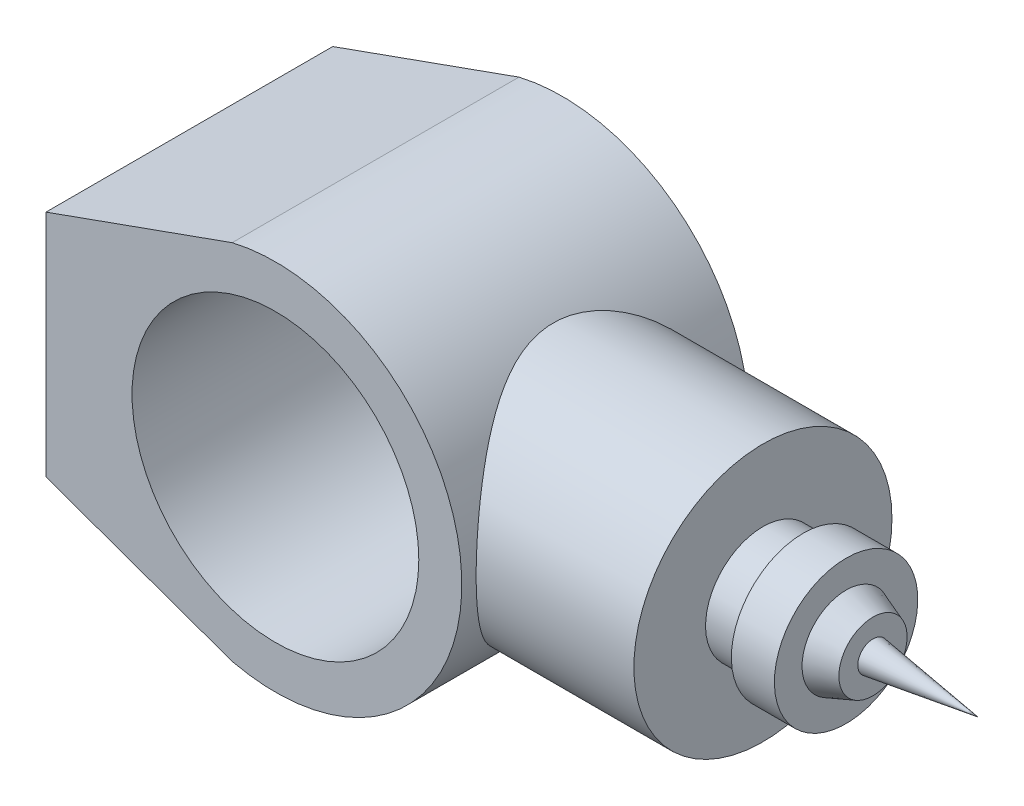
ISO-10303-21;
HEADER;
FILE_DESCRIPTION(('STEP AP214'),'2;1');
FILE_NAME('part.step','',(''),(''),'','','');
FILE_SCHEMA(('AUTOMOTIVE_DESIGN { 1 0 10303 214 1 1 1 1 }'));
ENDSEC;
DATA;
#1=APPLICATION_CONTEXT('core data for automotive mechanical design processes');
#2=APPLICATION_PROTOCOL_DEFINITION('international standard','automotive_design',2000,#1);
#3=PRODUCT_CONTEXT('',#1,'mechanical');
#4=PRODUCT('Part','Part','',(#3));
#5=PRODUCT_RELATED_PRODUCT_CATEGORY('part','',(#4));
#6=PRODUCT_DEFINITION_FORMATION('','',#4);
#7=PRODUCT_DEFINITION_CONTEXT('part definition',#1,'design');
#8=PRODUCT_DEFINITION('design','',#6,#7);
#9=PRODUCT_DEFINITION_SHAPE('','',#8);
#10=(LENGTH_UNIT() NAMED_UNIT(*) SI_UNIT(.MILLI.,.METRE.));
#11=(NAMED_UNIT(*) PLANE_ANGLE_UNIT() SI_UNIT($,.RADIAN.));
#12=(NAMED_UNIT(*) SI_UNIT($,.STERADIAN.) SOLID_ANGLE_UNIT());
#13=UNCERTAINTY_MEASURE_WITH_UNIT(LENGTH_MEASURE(1.E-05),#10,'distance_accuracy_value','');
#14=(GEOMETRIC_REPRESENTATION_CONTEXT(3) GLOBAL_UNCERTAINTY_ASSIGNED_CONTEXT((#13)) GLOBAL_UNIT_ASSIGNED_CONTEXT((#10,
#11,#12)) REPRESENTATION_CONTEXT('',''));
#15=CARTESIAN_POINT('',(0.,0.,0.));
#16=DIRECTION('',(0.,0.,1.));
#17=DIRECTION('',(1.,0.,0.));
#18=AXIS2_PLACEMENT_3D('',#15,#16,#17);
#19=CARTESIAN_POINT('',(0.,0.,50.));
#20=DIRECTION('',(0.,0.,1.));
#21=DIRECTION('',(1.,0.,0.));
#22=AXIS2_PLACEMENT_3D('',#19,#20,#21);
#23=PLANE('',#22);
#24=CARTESIAN_POINT('',(0.,0.,50.));
#25=DIRECTION('',(0.,0.,1.));
#26=DIRECTION('',(1.,0.,0.));
#27=AXIS2_PLACEMENT_3D('',#24,#25,#26);
#28=CIRCLE('',#27,65.);
#29=CARTESIAN_POINT('',(-15.0668531281222,-63.2296602617442,50.));
#30=VERTEX_POINT('',#29);
#31=CARTESIAN_POINT('',(-15.0668531281222,63.2296602617442,50.));
#32=VERTEX_POINT('',#31);
#33=EDGE_CURVE('E216',#30,#32,#28,.T.);
#34=ORIENTED_EDGE('',*,*,#33,.T.);
#35=DIRECTION('',(-0.941561501517248,-0.336841118126313,0.));
#36=VECTOR('',#35,1.);
#37=CARTESIAN_POINT('',(-80.,40.,50.));
#38=LINE('',#37,#36);
#39=CARTESIAN_POINT('',(-80.,40.,50.));
#40=VERTEX_POINT('',#39);
#41=EDGE_CURVE('E93',#32,#40,#38,.T.);
#42=ORIENTED_EDGE('',*,*,#41,.T.);
#43=DIRECTION('',(0.,-1.,0.));
#44=VECTOR('',#43,1.);
#45=CARTESIAN_POINT('',(-80.,-40.,50.));
#46=LINE('',#45,#44);
#47=CARTESIAN_POINT('',(-80.,-40.,50.));
#48=VERTEX_POINT('',#47);
#49=EDGE_CURVE('E209',#40,#48,#46,.T.);
#50=ORIENTED_EDGE('',*,*,#49,.T.);
#51=DIRECTION('',(0.941561501517248,-0.336841118126313,0.));
#52=VECTOR('',#51,1.);
#53=CARTESIAN_POINT('',(-80.,-40.,50.));
#54=LINE('',#53,#52);
#55=EDGE_CURVE('E61',#48,#30,#54,.T.);
#56=ORIENTED_EDGE('',*,*,#55,.T.);
#57=EDGE_LOOP('',(#34,#42,#50,#56));
#58=FACE_BOUND('',#57,.T.);
#59=CARTESIAN_POINT('',(0.,0.,50.));
#60=DIRECTION('',(0.,0.,1.));
#61=DIRECTION('',(1.,0.,0.));
#62=AXIS2_PLACEMENT_3D('',#59,#60,#61);
#63=CIRCLE('',#62,50.);
#64=CARTESIAN_POINT('',(50.,0.,50.));
#65=VERTEX_POINT('',#64);
#66=EDGE_CURVE('E143',#65,#65,#63,.T.);
#67=ORIENTED_EDGE('',*,*,#66,.F.);
#68=EDGE_LOOP('',(#67));
#69=FACE_BOUND('',#68,.T.);
#70=ADVANCED_FACE('F42',(#58,#69),#23,.T.);
#71=CARTESIAN_POINT('',(0.,0.,-50.));
#72=DIRECTION('',(0.,0.,1.));
#73=DIRECTION('',(1.,0.,0.));
#74=AXIS2_PLACEMENT_3D('',#71,#72,#73);
#75=PLANE('',#74);
#76=CARTESIAN_POINT('',(0.,0.,-50.));
#77=DIRECTION('',(0.,0.,1.));
#78=DIRECTION('',(1.,0.,0.));
#79=AXIS2_PLACEMENT_3D('',#76,#77,#78);
#80=CIRCLE('',#79,65.);
#81=CARTESIAN_POINT('',(-15.0668531281222,-63.2296602617442,-50.));
#82=VERTEX_POINT('',#81);
#83=CARTESIAN_POINT('',(-15.0668531281222,63.2296602617442,-50.));
#84=VERTEX_POINT('',#83);
#85=EDGE_CURVE('E207',#82,#84,#80,.T.);
#86=ORIENTED_EDGE('',*,*,#85,.F.);
#87=DIRECTION('',(0.941561501517248,-0.336841118126313,0.));
#88=VECTOR('',#87,1.);
#89=CARTESIAN_POINT('',(-80.,-40.,-50.));
#90=LINE('',#89,#88);
#91=CARTESIAN_POINT('',(-80.,-40.,-50.));
#92=VERTEX_POINT('',#91);
#93=EDGE_CURVE('E85',#92,#82,#90,.T.);
#94=ORIENTED_EDGE('',*,*,#93,.F.);
#95=DIRECTION('',(0.,-1.,0.));
#96=VECTOR('',#95,1.);
#97=CARTESIAN_POINT('',(-80.,-40.,-50.));
#98=LINE('',#97,#96);
#99=CARTESIAN_POINT('',(-80.,40.,-50.));
#100=VERTEX_POINT('',#99);
#101=EDGE_CURVE('E79',#100,#92,#98,.T.);
#102=ORIENTED_EDGE('',*,*,#101,.F.);
#103=DIRECTION('',(-0.941561501517248,-0.336841118126313,0.));
#104=VECTOR('',#103,1.);
#105=CARTESIAN_POINT('',(-80.,40.,-50.));
#106=LINE('',#105,#104);
#107=EDGE_CURVE('E200',#84,#100,#106,.T.);
#108=ORIENTED_EDGE('',*,*,#107,.F.);
#109=EDGE_LOOP('',(#86,#94,#102,#108));
#110=FACE_BOUND('',#109,.T.);
#111=CARTESIAN_POINT('',(0.,0.,-50.));
#112=DIRECTION('',(0.,0.,1.));
#113=DIRECTION('',(1.,0.,0.));
#114=AXIS2_PLACEMENT_3D('',#111,#112,#113);
#115=CIRCLE('',#114,50.);
#116=CARTESIAN_POINT('',(50.,0.,-50.));
#117=VERTEX_POINT('',#116);
#118=EDGE_CURVE('E134',#117,#117,#115,.T.);
#119=ORIENTED_EDGE('',*,*,#118,.T.);
#120=EDGE_LOOP('',(#119));
#121=FACE_BOUND('',#120,.T.);
#122=ADVANCED_FACE('F180',(#110,#121),#75,.F.);
#123=CARTESIAN_POINT('',(0.,0.,50.));
#124=DIRECTION('',(0.,0.,-1.));
#125=DIRECTION('',(-1.,0.,0.));
#126=AXIS2_PLACEMENT_3D('',#123,#124,#125);
#127=CYLINDRICAL_SURFACE('',#126,65.);
#128=CARTESIAN_POINT('',(65.,0.,-45.));
#129=CARTESIAN_POINT('',(65.0000011696056,1.12147330120565,-45.0000012025283));
#130=CARTESIAN_POINT('',(64.9709159765212,2.24292945230778,-44.9580201602482));
#131=CARTESIAN_POINT('',(64.8553068641382,4.47658414079082,-44.790785609369));
#132=CARTESIAN_POINT('',(64.7687842573088,5.58878288911931,-44.6655340035371));
#133=CARTESIAN_POINT('',(64.5403785763001,7.79555151848628,-44.3336771879691));
#134=CARTESIAN_POINT('',(64.3984760503456,8.89011506447751,-44.1270433931238));
#135=CARTESIAN_POINT('',(64.0626457436965,11.0533096019768,-43.6354760134034));
#136=CARTESIAN_POINT('',(63.8687169569864,12.1219400915896,-43.3505409144375));
#137=CARTESIAN_POINT('',(63.4342222744662,14.2212125160505,-42.7078017297046));
#138=CARTESIAN_POINT('',(63.1938918545644,15.2520162370063,-42.3503651251477));
#139=CARTESIAN_POINT('',(62.6709259446924,17.2756280115286,-41.5659763086892));
#140=CARTESIAN_POINT('',(62.3882907364914,18.268436318107,-41.1390245597888));
#141=CARTESIAN_POINT('',(61.786108553932,20.2116697228795,-40.2199419970838));
#142=CARTESIAN_POINT('',(61.4665619062631,21.1620951960855,-39.7278117601444));
#143=CARTESIAN_POINT('',(60.7962171584065,23.0172309124315,-38.6825647509799));
#144=CARTESIAN_POINT('',(60.4454175300334,23.9219389167185,-38.1294449962195));
#145=CARTESIAN_POINT('',(59.6865648974474,25.7601880140228,-36.9151737617935));
#146=CARTESIAN_POINT('',(59.2761881540199,26.6893215363404,-36.2488040005491));
#147=CARTESIAN_POINT('',(58.4330275057249,28.4880338622967,-34.8529502059224));
#148=CARTESIAN_POINT('',(58.0002425478181,29.3576098626539,-34.1234632053608));
#149=CARTESIAN_POINT('',(57.1195111836477,31.0364486388513,-32.6040251352403));
#150=CARTESIAN_POINT('',(56.6715447181891,31.8456267033451,-31.8139921794122));
#151=CARTESIAN_POINT('',(55.7691986061138,33.4006700551814,-30.1773036556993));
#152=CARTESIAN_POINT('',(55.3148185876119,34.1465316534289,-29.3306447936721));
#153=CARTESIAN_POINT('',(54.3303114345595,35.6959084068904,-27.4326466159468));
#154=CARTESIAN_POINT('',(53.8005937511269,36.4872853280241,-26.3711450656526));
#155=CARTESIAN_POINT('',(52.7593327891933,37.9773509509911,-24.17604025639));
#156=CARTESIAN_POINT('',(52.2477941160227,38.6760162868262,-23.0424189272517));
#157=CARTESIAN_POINT('',(51.2608149265043,39.9749077721744,-20.7072341856928));
#158=CARTESIAN_POINT('',(50.7853275075273,40.5752630453964,-19.5057627267967));
#159=CARTESIAN_POINT('',(49.8892399163793,41.6721166930025,-17.036931864064));
#160=CARTESIAN_POINT('',(49.4686114171658,42.1686687478853,-15.7696069409943));
#161=CARTESIAN_POINT('',(48.8208029416879,42.9149535309565,-13.5723996352816));
#162=CARTESIAN_POINT('',(48.5738420263557,43.1936925213245,-12.6581208440976));
#163=CARTESIAN_POINT('',(48.1238801744123,43.6944569649788,-10.8035389223551));
#164=CARTESIAN_POINT('',(47.9208721021929,43.9164916250901,-9.8632400440742));
#165=CARTESIAN_POINT('',(47.5660754926547,44.3005296261305,-7.9625043866341));
#166=CARTESIAN_POINT('',(47.4142038087044,44.4626304606427,-7.00210302149488));
#167=CARTESIAN_POINT('',(47.1671263845177,44.7246555122386,-5.06554052628519));
#168=CARTESIAN_POINT('',(47.0719206259529,44.824579749433,-4.08937940131226));
#169=CARTESIAN_POINT('',(46.9418899090943,44.9607388198673,-2.12323648479672));
#170=CARTESIAN_POINT('',(46.9073939345417,44.9966266570423,-1.13320851844659));
#171=CARTESIAN_POINT('',(46.9013571135476,45.0029190462422,0.847248377093837));
#172=CARTESIAN_POINT('',(46.9298161498631,44.9733237202183,1.83767730553398));
#173=CARTESIAN_POINT('',(47.0484302849821,44.8492190899201,3.8112875242908));
#174=CARTESIAN_POINT('',(47.13862305521,44.7546701492421,4.7944640185066));
#175=CARTESIAN_POINT('',(47.3768313176079,44.5024241630868,6.74551496467455));
#176=CARTESIAN_POINT('',(47.5248480621437,44.3447257499009,7.71338908473168));
#177=CARTESIAN_POINT('',(47.862176427184,43.9803320764262,9.56919366964684));
#178=CARTESIAN_POINT('',(48.0484149088864,43.7772163066585,10.4583970625519));
#179=CARTESIAN_POINT('',(48.4609441046406,43.32010640119,12.2144143492181));
#180=CARTESIAN_POINT('',(48.6872496045114,43.0660934784814,13.0812198417583));
#181=CARTESIAN_POINT('',(49.1738509640383,42.5096331932465,14.7898225666927));
#182=CARTESIAN_POINT('',(49.4341648638834,42.2071601049958,15.6316062329481));
#183=CARTESIAN_POINT('',(49.9825182796335,41.5563350032135,17.2876417419013));
#184=CARTESIAN_POINT('',(50.2705534011696,41.2079902580444,18.1018979206949));
#185=CARTESIAN_POINT('',(51.0225431471344,40.2767822129268,20.1137766396802));
#186=CARTESIAN_POINT('',(51.5007434523328,39.6654891440572,21.2930273345177));
#187=CARTESIAN_POINT('',(52.4891158781477,38.348029920852,23.5833678403921));
#188=CARTESIAN_POINT('',(52.9993005340588,37.6418264436726,24.6944305853524));
#189=CARTESIAN_POINT('',(54.0361557973494,36.1376496350166,26.8476775780095));
#190=CARTESIAN_POINT('',(54.5628535785461,35.3395185623559,27.8897384505711));
#191=CARTESIAN_POINT('',(55.6171804467178,33.6558443419671,29.8998791095632));
#192=CARTESIAN_POINT('',(56.1448094104418,32.7703120184234,30.8679680307498));
#193=CARTESIAN_POINT('',(57.1932449701135,30.9045304086319,32.7363921475659));
#194=CARTESIAN_POINT('',(57.7139191350982,29.9233731295192,33.6358963165067));
#195=CARTESIAN_POINT('',(58.7296419536465,27.8771206485979,35.350355349792));
#196=CARTESIAN_POINT('',(59.2246882700661,26.8120178135979,36.1653025097018));
#197=CARTESIAN_POINT('',(60.1756566955639,24.6035209522421,37.7024332048813));
#198=CARTESIAN_POINT('',(60.6316475651595,23.4602711709794,38.4247809320632));
#199=CARTESIAN_POINT('',(61.4931891608211,21.0989507187335,39.7703323765769));
#200=CARTESIAN_POINT('',(61.898755017873,19.8809026570889,40.3935658507715));
#201=CARTESIAN_POINT('',(62.5646802947783,17.6549035875762,41.4059204565395));
#202=CARTESIAN_POINT('',(62.8372982548467,16.6602403417733,41.8163120535009));
#203=CARTESIAN_POINT('',(63.3397164077328,14.6345031625144,42.5675669112335));
#204=CARTESIAN_POINT('',(63.569522535998,13.603434299959,42.9084398107234));
#205=CARTESIAN_POINT('',(63.9815049902596,11.5110112910016,43.5164676119118));
#206=CARTESIAN_POINT('',(64.1637052650743,10.4496726714621,43.7836595836378));
#207=CARTESIAN_POINT('',(64.476639865795,8.30296993183373,44.2409869387356));
#208=CARTESIAN_POINT('',(64.6073730982257,7.21760530180255,44.431120684921));
#209=CARTESIAN_POINT('',(64.8147345736682,5.02649787175025,44.7321113931982));
#210=CARTESIAN_POINT('',(64.8911534961694,3.92069290489765,44.8426616714377));
#211=CARTESIAN_POINT('',(64.9872183357685,1.7014535077621,44.981563734156));
#212=CARTESIAN_POINT('',(65.0068642771873,0.588019080747718,45.0099155538474));
#213=CARTESIAN_POINT('',(64.9889001241945,-1.63741781931563,44.9839662509349));
#214=CARTESIAN_POINT('',(64.9512898349751,-2.74942028747964,44.929664847113));
#215=CARTESIAN_POINT('',(64.8197344180529,-4.96298947367599,44.7392747901952));
#216=CARTESIAN_POINT('',(64.7257910494465,-6.06455651648124,44.6031886909653));
#217=CARTESIAN_POINT('',(64.491175703309,-8.18254449212147,44.2620157992034));
#218=CARTESIAN_POINT('',(64.3536808680178,-9.20007959997772,44.0616107864454));
#219=CARTESIAN_POINT('',(64.0337856060907,-11.2121337136588,43.593061351668));
#220=CARTESIAN_POINT('',(63.8513873855499,-12.2066538475799,43.3249202574929));
#221=CARTESIAN_POINT('',(63.4451725249075,-14.1673074608522,42.7239854011605));
#222=CARTESIAN_POINT('',(63.2213525684632,-15.1334386601222,42.3911864622048));
#223=CARTESIAN_POINT('',(62.736336352677,-17.0327019487273,41.6643868113869));
#224=CARTESIAN_POINT('',(62.4751380044848,-17.965832190203,41.2703826790343));
#225=CARTESIAN_POINT('',(61.8990085085122,-19.8637431772395,40.3931275129008));
#226=CARTESIAN_POINT('',(61.58152095285,-20.8256806929253,39.9054081529014));
#227=CARTESIAN_POINT('',(60.9142086391395,-22.7035764997345,38.8677076181211));
#228=CARTESIAN_POINT('',(60.5643826081083,-23.6195329786528,38.3177239921568));
#229=CARTESIAN_POINT('',(59.8381347129401,-25.4032558353403,37.1592008079418));
#230=CARTESIAN_POINT('',(59.4616987975441,-26.270996314329,36.5506302507532));
#231=CARTESIAN_POINT('',(58.6884577670336,-27.9557544991496,35.2787474176625));
#232=CARTESIAN_POINT('',(58.2916515549571,-28.7727694681138,34.615432192531));
#233=CARTESIAN_POINT('',(57.4151711853793,-30.4889708749911,33.1199200847162));
#234=CARTESIAN_POINT('',(56.9328754552547,-31.3785212006928,32.2781812569548));
#235=CARTESIAN_POINT('',(55.9590893109094,-33.0839042215169,30.527835244559));
#236=CARTESIAN_POINT('',(55.4675975421249,-33.8997259516807,29.61921815009));
#237=CARTESIAN_POINT('',(54.4860350387396,-35.45586994741,27.7375714933993));
#238=CARTESIAN_POINT('',(53.9959654596117,-36.1961418986443,26.7644997080007));
#239=CARTESIAN_POINT('',(53.0294834997435,-37.5978502361011,24.7568233036382));
#240=CARTESIAN_POINT('',(52.553069328415,-38.2592969946585,23.7222268074149));
#241=CARTESIAN_POINT('',(51.679941347726,-39.4291013564639,21.7149007388747));
#242=CARTESIAN_POINT('',(51.2803372484816,-39.9463152685162,20.7485884228094));
#243=CARTESIAN_POINT('',(50.5123974548912,-40.9130636661729,18.7705314851886));
#244=CARTESIAN_POINT('',(50.1440619804653,-41.3625976757847,17.7587865441704));
#245=CARTESIAN_POINT('',(49.4504928922364,-42.1893301292689,15.693797265063));
#246=CARTESIAN_POINT('',(49.1251906412472,-42.566644202947,14.6406225749502));
#247=CARTESIAN_POINT('',(48.5290098021012,-43.2451098617227,12.4950157035289));
#248=CARTESIAN_POINT('',(48.2581179989952,-43.5462799449171,11.4025931307278));
#249=CARTESIAN_POINT('',(47.8271610412375,-44.018687486118,9.39216299943514));
#250=CARTESIAN_POINT('',(47.6558419905218,-44.2036946073207,8.47979353570423));
#251=CARTESIAN_POINT('',(47.3627606953031,-44.517583244497,6.6375758266825));
#252=CARTESIAN_POINT('',(47.2409923142224,-44.6464717105955,5.70772976070378));
#253=CARTESIAN_POINT('',(47.05166615705,-44.8459556683364,3.83718735816976));
#254=CARTESIAN_POINT('',(46.9840561376509,-44.9166073394188,2.89650236820519));
#255=CARTESIAN_POINT('',(46.9055698265682,-44.9985645522097,1.01014116515039));
#256=CARTESIAN_POINT('',(46.894694331428,-45.0098692606967,0.0644648821698225));
#257=CARTESIAN_POINT('',(46.9301408777118,-44.972908524549,-1.82506201386802));
#258=CARTESIAN_POINT('',(46.9764888551696,-44.9246160680299,-2.768911604742));
#259=CARTESIAN_POINT('',(47.1245232303033,-44.7693052695385,-4.64731891289862));
#260=CARTESIAN_POINT('',(47.226209296244,-44.6622872796082,-5.58187668584875));
#261=CARTESIAN_POINT('',(47.4811423262629,-44.3911660407895,-7.4366659860656));
#262=CARTESIAN_POINT('',(47.634452919394,-44.2269923369625,-8.35687836049677));
#263=CARTESIAN_POINT('',(47.9871889035597,-43.8440109221367,-10.1768310643422));
#264=CARTESIAN_POINT('',(48.1866204648689,-43.6251959006593,-11.0765686368372));
#265=CARTESIAN_POINT('',(48.6908782922366,-43.0625185245671,-13.116726178063));
#266=CARTESIAN_POINT('',(49.0093972350599,-42.7008255731353,-14.2488681052183));
#267=CARTESIAN_POINT('',(49.699554494161,-41.8955268796886,-16.4668795226373));
#268=CARTESIAN_POINT('',(50.0712093704162,-41.4518955887103,-17.5527344499461));
#269=CARTESIAN_POINT('',(50.8544123719762,-40.4872212981013,-19.6760329984318));
#270=CARTESIAN_POINT('',(51.2660067549033,-39.9660881554129,-20.7134183727638));
#271=CARTESIAN_POINT('',(52.116211879306,-38.8508952329155,-22.7363587217865));
#272=CARTESIAN_POINT('',(52.5548209260535,-38.2568400254561,-23.7219169406072));
#273=CARTESIAN_POINT('',(53.4579357785502,-36.9847423381263,-25.6613286822633));
#274=CARTESIAN_POINT('',(53.9228021101371,-36.3051118639051,-26.6139712103077));
#275=CARTESIAN_POINT('',(54.8583333343946,-34.8753950985048,-28.4617532840731));
#276=CARTESIAN_POINT('',(55.3289982185488,-34.1253089107937,-29.3568929142367));
#277=CARTESIAN_POINT('',(56.2664339133502,-32.5564691651912,-31.0876310121466));
#278=CARTESIAN_POINT('',(56.7332035093429,-31.7376950080829,-31.923211478402));
#279=CARTESIAN_POINT('',(57.6535165855435,-30.033481652025,-33.5315189390535));
#280=CARTESIAN_POINT('',(58.1070588196761,-29.1480362003111,-34.3042400240121));
#281=CARTESIAN_POINT('',(59.0635284336244,-27.1643113596245,-35.9022819462666));
#282=CARTESIAN_POINT('',(59.5626106290919,-26.054747286961,-36.7159606163356));
#283=CARTESIAN_POINT('',(60.5176757229357,-23.7521280348398,-38.2458641369291));
#284=CARTESIAN_POINT('',(60.9736519283073,-22.5590599397197,-38.962073861155));
#285=CARTESIAN_POINT('',(61.6149926579414,-20.7127348127311,-39.9558623322098));
#286=CARTESIAN_POINT('',(61.8215919655178,-20.088110583999,-40.2735888165198));
#287=CARTESIAN_POINT('',(62.2191547005856,-18.8206694867556,-40.8812436548858));
#288=CARTESIAN_POINT('',(62.4101203779565,-18.1778552539997,-41.1711760099034));
#289=CARTESIAN_POINT('',(62.7748527233683,-16.875283117665,-41.7219931318356));
#290=CARTESIAN_POINT('',(62.9486230408552,-16.2155288469421,-41.9828840638124));
#291=CARTESIAN_POINT('',(63.2775356475736,-14.8804011558234,-42.4744610119283));
#292=CARTESIAN_POINT('',(63.432679284421,-14.2050288695918,-42.7051492133045));
#293=CARTESIAN_POINT('',(63.80707219681,-12.4447010544915,-43.25974494481));
#294=CARTESIAN_POINT('',(64.0114184468014,-11.3490405228654,-43.5602757498286));
#295=CARTESIAN_POINT('',(64.3654191982087,-9.12991345978804,-44.0788276443961));
#296=CARTESIAN_POINT('',(64.5150820049425,-8.00645117856259,-44.2968612637911));
#297=CARTESIAN_POINT('',(64.7559993187061,-5.74082253729115,-44.6470112993716));
#298=CARTESIAN_POINT('',(64.847297757104,-4.59867091062177,-44.7791923387443));
#299=CARTESIAN_POINT('',(64.9692976296881,-2.30434018473199,-44.9556862638234));
#300=CARTESIAN_POINT('',(64.9999987983895,-1.15216104160191,-44.999998764566));
#301=CARTESIAN_POINT('',(65.,0.,-45.));
#302=B_SPLINE_CURVE_WITH_KNOTS('',3,(#128,#129,#130,#131,#132,#133,#134,#135,#136,#137,#138,
#139,#140,#141,#142,#143,#144,#145,#146,#147,#148,#149,#150,#151,#152,#153,#154,#155,#156,#157,
#158,#159,#160,#161,#162,#163,#164,#165,#166,#167,#168,#169,#170,#171,#172,#173,#174,#175,#176,
#177,#178,#179,#180,#181,#182,#183,#184,#185,#186,#187,#188,#189,#190,#191,#192,#193,#194,#195,
#196,#197,#198,#199,#200,#201,#202,#203,#204,#205,#206,#207,#208,#209,#210,#211,#212,#213,#214,
#215,#216,#217,#218,#219,#220,#221,#222,#223,#224,#225,#226,#227,#228,#229,#230,#231,#232,#233,
#234,#235,#236,#237,#238,#239,#240,#241,#242,#243,#244,#245,#246,#247,#248,#249,#250,#251,#252,
#253,#254,#255,#256,#257,#258,#259,#260,#261,#262,#263,#264,#265,#266,#267,#268,#269,#270,#271,
#272,#273,#274,#275,#276,#277,#278,#279,#280,#281,#282,#283,#284,#285,#286,#287,#288,#289,#290,
#291,#292,#293,#294,#295,#296,#297,#298,#299,#300,#301),.UNSPECIFIED.,.T.,.F.,(4,2,2,2,2,2,2,2,
2,2,2,2,2,2,2,2,2,2,2,2,2,2,2,2,2,2,2,2,2,2,2,2,2,2,2,2,2,2,2,2,2,2,2,2,2,2,2,2,2,2,2,2,2,2,2,2,
2,2,2,2,2,2,2,2,2,2,2,2,2,2,2,2,2,2,2,2,2,2,2,2,2,2,2,2,2,2,4),(0.,3.36323892794144,
6.72640100710137,10.0907454360665,13.4551549250109,16.8029195613731,20.1506619010729,
23.4983746134034,26.8462511096753,30.4871649037346,34.1282499524345,37.7743494260164,
41.4206611917409,45.6939383064405,49.9682903731881,54.2369825353392,58.5034617073671,
61.4625138492405,64.4210852373372,67.3748225577202,70.3285589227264,73.2982527376573,
76.2679410220408,79.2394430998938,82.2110095388412,85.0011411726389,87.7923045951578,
90.584954683776,93.3771628083065,97.6064034875675,101.837312178738,106.075592113262,
110.313347816192,114.596218662803,118.879479402292,123.155037051935,127.429308626693,
130.755998382163,134.082226580387,137.406778235214,140.731400520075,144.068767009318,
147.406132068879,150.743508483461,154.080780688207,157.215791533369,160.350648386749,
163.485756334407,166.621039552604,169.990545063149,173.360183268584,176.73161428665,
180.103227050672,184.047902440152,187.993163521895,191.94103513809,195.888386692538,
199.385185586645,202.88200907258,206.373186157811,209.863514294626,212.700365177753,
215.536864625513,218.370624567028,221.204424293963,224.039508887241,226.874576485218,
229.713151272815,232.55210603787,236.23803941247,239.925124033801,243.616531168718,
247.307706963636,251.081871120678,254.856029735251,258.631324277359,262.406973327354,
266.792058434818,271.177823293658,273.368885604935,275.55963203795,277.749912517597,
279.940034437727,283.398420446896,286.856280978073,290.31153567335,293.766805506531),.UNSPECIFIED.);
#303=CARTESIAN_POINT('',(65.,0.,-45.));
#304=VERTEX_POINT('',#303);
#305=EDGE_CURVE('E128',#304,#304,#302,.T.);
#306=ORIENTED_EDGE('',*,*,#305,.F.);
#307=EDGE_LOOP('',(#306));
#308=FACE_BOUND('',#307,.T.);
#309=ORIENTED_EDGE('',*,*,#85,.T.);
#310=DIRECTION('',(0.,0.,-1.));
#311=VECTOR('',#310,1.);
#312=CARTESIAN_POINT('',(-15.0668531281222,63.2296602617442,50.));
#313=LINE('',#312,#311);
#314=EDGE_CURVE('E46',#32,#84,#313,.T.);
#315=ORIENTED_EDGE('',*,*,#314,.F.);
#316=ORIENTED_EDGE('',*,*,#33,.F.);
#317=DIRECTION('',(0.,0.,-1.));
#318=VECTOR('',#317,1.);
#319=CARTESIAN_POINT('',(-15.0668531281222,-63.2296602617442,50.));
#320=LINE('',#319,#318);
#321=EDGE_CURVE('E220',#30,#82,#320,.T.);
#322=ORIENTED_EDGE('',*,*,#321,.T.);
#323=EDGE_LOOP('',(#309,#315,#316,#322));
#324=FACE_BOUND('',#323,.T.);
#325=ADVANCED_FACE('F44',(#308,#324),#127,.T.);
#326=CARTESIAN_POINT('',(-80.,40.,50.));
#327=DIRECTION('',(0.336841118126313,-0.941561501517248,0.));
#328=DIRECTION('',(0.941561501517248,0.336841118126313,0.));
#329=AXIS2_PLACEMENT_3D('',#326,#327,#328);
#330=PLANE('',#329);
#331=ORIENTED_EDGE('',*,*,#107,.T.);
#332=DIRECTION('',(0.,0.,-1.));
#333=VECTOR('',#332,1.);
#334=CARTESIAN_POINT('',(-80.,40.,50.));
#335=LINE('',#334,#333);
#336=EDGE_CURVE('E201',#40,#100,#335,.T.);
#337=ORIENTED_EDGE('',*,*,#336,.F.);
#338=ORIENTED_EDGE('',*,*,#41,.F.);
#339=ORIENTED_EDGE('',*,*,#314,.T.);
#340=EDGE_LOOP('',(#331,#337,#338,#339));
#341=FACE_BOUND('',#340,.T.);
#342=ADVANCED_FACE('F194',(#341),#330,.F.);
#343=CARTESIAN_POINT('',(-80.,-40.,50.));
#344=DIRECTION('',(1.,0.,0.));
#345=DIRECTION('',(0.,0.,-1.));
#346=AXIS2_PLACEMENT_3D('',#343,#344,#345);
#347=PLANE('',#346);
#348=ORIENTED_EDGE('',*,*,#101,.T.);
#349=DIRECTION('',(0.,0.,-1.));
#350=VECTOR('',#349,1.);
#351=CARTESIAN_POINT('',(-80.,-40.,50.));
#352=LINE('',#351,#350);
#353=EDGE_CURVE('E211',#48,#92,#352,.T.);
#354=ORIENTED_EDGE('',*,*,#353,.F.);
#355=ORIENTED_EDGE('',*,*,#49,.F.);
#356=ORIENTED_EDGE('',*,*,#336,.T.);
#357=EDGE_LOOP('',(#348,#354,#355,#356));
#358=FACE_BOUND('',#357,.T.);
#359=ADVANCED_FACE('F192',(#358),#347,.F.);
#360=CARTESIAN_POINT('',(-80.,-40.,50.));
#361=DIRECTION('',(0.336841118126313,0.941561501517248,0.));
#362=DIRECTION('',(-0.941561501517248,0.336841118126313,0.));
#363=AXIS2_PLACEMENT_3D('',#360,#361,#362);
#364=PLANE('',#363);
#365=ORIENTED_EDGE('',*,*,#93,.T.);
#366=ORIENTED_EDGE('',*,*,#321,.F.);
#367=ORIENTED_EDGE('',*,*,#55,.F.);
#368=ORIENTED_EDGE('',*,*,#353,.T.);
#369=EDGE_LOOP('',(#365,#366,#367,#368));
#370=FACE_BOUND('',#369,.T.);
#371=ADVANCED_FACE('F189',(#370),#364,.F.);
#372=CARTESIAN_POINT('',(0.,0.,50.));
#373=DIRECTION('',(0.,0.,-1.));
#374=DIRECTION('',(-1.,0.,0.));
#375=AXIS2_PLACEMENT_3D('',#372,#373,#374);
#376=CYLINDRICAL_SURFACE('',#375,50.);
#377=ORIENTED_EDGE('',*,*,#66,.T.);
#378=EDGE_LOOP('',(#377));
#379=FACE_BOUND('',#378,.T.);
#380=ORIENTED_EDGE('',*,*,#118,.F.);
#381=EDGE_LOOP('',(#380));
#382=FACE_BOUND('',#381,.T.);
#383=ADVANCED_FACE('F153',(#379,#382),#376,.F.);
#384=CARTESIAN_POINT('',(120.,0.,0.));
#385=DIRECTION('',(1.,0.,0.));
#386=DIRECTION('',(0.,0.,-1.));
#387=AXIS2_PLACEMENT_3D('',#384,#385,#386);
#388=PLANE('',#387);
#389=CARTESIAN_POINT('',(120.,0.,0.));
#390=DIRECTION('',(1.,0.,0.));
#391=DIRECTION('',(0.,1.,0.));
#392=AXIS2_PLACEMENT_3D('',#389,#390,#391);
#393=CIRCLE('',#392,20.);
#394=CARTESIAN_POINT('',(120.,20.,0.));
#395=VERTEX_POINT('',#394);
#396=EDGE_CURVE('E11',#395,#395,#393,.T.);
#397=ORIENTED_EDGE('',*,*,#396,.F.);
#398=EDGE_LOOP('',(#397));
#399=FACE_BOUND('',#398,.T.);
#400=CARTESIAN_POINT('',(120.,0.,0.));
#401=DIRECTION('',(1.,0.,0.));
#402=DIRECTION('',(0.,0.,-1.));
#403=AXIS2_PLACEMENT_3D('',#400,#401,#402);
#404=CIRCLE('',#403,45.);
#405=CARTESIAN_POINT('',(120.,0.,-45.));
#406=VERTEX_POINT('',#405);
#407=EDGE_CURVE('E130',#406,#406,#404,.T.);
#408=ORIENTED_EDGE('',*,*,#407,.T.);
#409=EDGE_LOOP('',(#408));
#410=FACE_BOUND('',#409,.T.);
#411=ADVANCED_FACE('F150',(#399,#410),#388,.T.);
#412=CARTESIAN_POINT('',(-80.002,0.,0.));
#413=DIRECTION('',(1.,0.,0.));
#414=DIRECTION('',(0.,0.,-1.));
#415=AXIS2_PLACEMENT_3D('',#412,#413,#414);
#416=CYLINDRICAL_SURFACE('',#415,45.);
#417=ORIENTED_EDGE('',*,*,#407,.F.);
#418=EDGE_LOOP('',(#417));
#419=FACE_BOUND('',#418,.T.);
#420=ORIENTED_EDGE('',*,*,#305,.T.);
#421=EDGE_LOOP('',(#420));
#422=FACE_BOUND('',#421,.T.);
#423=ADVANCED_FACE('F145',(#419,#422),#416,.T.);
#424=CARTESIAN_POINT('',(195.,0.,0.));
#425=DIRECTION('',(1.,0.,0.));
#426=DIRECTION('',(0.,1.,0.));
#427=AXIS2_PLACEMENT_3D('',#424,#425,#426);
#428=CYLINDRICAL_SURFACE('',#427,20.);
#429=CARTESIAN_POINT('',(134.,0.,0.));
#430=DIRECTION('',(1.,0.,0.));
#431=DIRECTION('',(0.,1.,0.));
#432=AXIS2_PLACEMENT_3D('',#429,#430,#431);
#433=CIRCLE('',#432,20.);
#434=CARTESIAN_POINT('',(134.,20.,0.));
#435=VERTEX_POINT('',#434);
#436=EDGE_CURVE('E125',#435,#435,#433,.T.);
#437=ORIENTED_EDGE('',*,*,#436,.F.);
#438=EDGE_LOOP('',(#437));
#439=FACE_BOUND('',#438,.T.);
#440=ORIENTED_EDGE('',*,*,#396,.T.);
#441=EDGE_LOOP('',(#440));
#442=FACE_BOUND('',#441,.T.);
#443=ADVANCED_FACE('F155',(#439,#442),#428,.T.);
#444=CARTESIAN_POINT('',(134.,-20.,0.));
#445=DIRECTION('',(1.,0.,0.));
#446=DIRECTION('',(0.,1.,0.));
#447=AXIS2_PLACEMENT_3D('',#444,#445,#446);
#448=PLANE('',#447);
#449=CARTESIAN_POINT('',(134.,0.,0.));
#450=DIRECTION('',(1.,0.,0.));
#451=DIRECTION('',(0.,1.,0.));
#452=AXIS2_PLACEMENT_3D('',#449,#450,#451);
#453=CIRCLE('',#452,25.);
#454=CARTESIAN_POINT('',(134.,25.,0.));
#455=VERTEX_POINT('',#454);
#456=EDGE_CURVE('E121',#455,#455,#453,.T.);
#457=ORIENTED_EDGE('',*,*,#456,.F.);
#458=EDGE_LOOP('',(#457));
#459=FACE_BOUND('',#458,.T.);
#460=ORIENTED_EDGE('',*,*,#436,.T.);
#461=EDGE_LOOP('',(#460));
#462=FACE_BOUND('',#461,.T.);
#463=ADVANCED_FACE('F158',(#459,#462),#448,.F.);
#464=CARTESIAN_POINT('',(195.,0.,0.));
#465=DIRECTION('',(1.,0.,0.));
#466=DIRECTION('',(0.,1.,0.));
#467=AXIS2_PLACEMENT_3D('',#464,#465,#466);
#468=CYLINDRICAL_SURFACE('',#467,25.);
#469=CARTESIAN_POINT('',(149.,0.,0.));
#470=DIRECTION('',(1.,0.,0.));
#471=DIRECTION('',(0.,1.,0.));
#472=AXIS2_PLACEMENT_3D('',#469,#470,#471);
#473=CIRCLE('',#472,25.);
#474=CARTESIAN_POINT('',(149.,25.,0.));
#475=VERTEX_POINT('',#474);
#476=EDGE_CURVE('E117',#475,#475,#473,.T.);
#477=ORIENTED_EDGE('',*,*,#476,.F.);
#478=EDGE_LOOP('',(#477));
#479=FACE_BOUND('',#478,.T.);
#480=ORIENTED_EDGE('',*,*,#456,.T.);
#481=EDGE_LOOP('',(#480));
#482=FACE_BOUND('',#481,.T.);
#483=ADVANCED_FACE('F162',(#479,#482),#468,.T.);
#484=CARTESIAN_POINT('',(149.,-25.,0.));
#485=DIRECTION('',(-1.,0.,0.));
#486=DIRECTION('',(0.,-1.,0.));
#487=AXIS2_PLACEMENT_3D('',#484,#485,#486);
#488=PLANE('',#487);
#489=CARTESIAN_POINT('',(149.,0.,0.));
#490=DIRECTION('',(1.,0.,0.));
#491=DIRECTION('',(0.,1.,0.));
#492=AXIS2_PLACEMENT_3D('',#489,#490,#491);
#493=CIRCLE('',#492,15.3535443197579);
#494=CARTESIAN_POINT('',(149.,15.3535443197579,0.));
#495=VERTEX_POINT('',#494);
#496=EDGE_CURVE('E111',#495,#495,#493,.T.);
#497=ORIENTED_EDGE('',*,*,#496,.F.);
#498=EDGE_LOOP('',(#497));
#499=FACE_BOUND('',#498,.T.);
#500=ORIENTED_EDGE('',*,*,#476,.T.);
#501=EDGE_LOOP('',(#500));
#502=FACE_BOUND('',#501,.T.);
#503=ADVANCED_FACE('F166',(#499,#502),#488,.F.);
#504=CARTESIAN_POINT('',(149.,0.,0.));
#505=DIRECTION('',(-1.,0.,0.));
#506=DIRECTION('',(0.,-1.,0.));
#507=AXIS2_PLACEMENT_3D('',#504,#505,#506);
#508=CONICAL_SURFACE('',#507,15.3535443197579,0.353564108758184);
#509=CARTESIAN_POINT('',(158.381446239971,0.,0.));
#510=DIRECTION('',(1.,0.,0.));
#511=DIRECTION('',(0.,1.,0.));
#512=AXIS2_PLACEMENT_3D('',#509,#510,#511);
#513=CIRCLE('',#512,11.8911078298658);
#514=CARTESIAN_POINT('',(158.381446239971,11.8911078298658,0.));
#515=VERTEX_POINT('',#514);
#516=EDGE_CURVE('E107',#515,#515,#513,.T.);
#517=ORIENTED_EDGE('',*,*,#516,.F.);
#518=EDGE_LOOP('',(#517));
#519=FACE_BOUND('',#518,.T.);
#520=ORIENTED_EDGE('',*,*,#496,.T.);
#521=EDGE_LOOP('',(#520));
#522=FACE_BOUND('',#521,.T.);
#523=ADVANCED_FACE('F170',(#519,#522),#508,.T.);
#524=CARTESIAN_POINT('',(158.381446239971,-11.8911078298658,0.));
#525=DIRECTION('',(-1.,0.,0.));
#526=DIRECTION('',(0.,-1.,0.));
#527=AXIS2_PLACEMENT_3D('',#524,#525,#526);
#528=PLANE('',#527);
#529=CARTESIAN_POINT('',(158.381446239971,0.,0.));
#530=DIRECTION('',(1.,0.,0.));
#531=DIRECTION('',(0.,1.,0.));
#532=AXIS2_PLACEMENT_3D('',#529,#530,#531);
#533=CIRCLE('',#532,5.29919998904146);
#534=CARTESIAN_POINT('',(158.381446239971,5.29919998904146,0.));
#535=VERTEX_POINT('',#534);
#536=EDGE_CURVE('E104',#535,#535,#533,.T.);
#537=ORIENTED_EDGE('',*,*,#536,.F.);
#538=EDGE_LOOP('',(#537));
#539=FACE_BOUND('',#538,.T.);
#540=ORIENTED_EDGE('',*,*,#516,.T.);
#541=EDGE_LOOP('',(#540));
#542=FACE_BOUND('',#541,.T.);
#543=ADVANCED_FACE('F100',(#539,#542),#528,.F.);
#544=CARTESIAN_POINT('',(158.381446239971,0.,0.));
#545=DIRECTION('',(-1.,0.,0.));
#546=DIRECTION('',(0.,-1.,0.));
#547=AXIS2_PLACEMENT_3D('',#544,#545,#546);
#548=CONICAL_SURFACE('',#547,5.29919998904146,0.143715834249303);
#549=CARTESIAN_POINT('',(195.,0.,0.));
#550=VERTEX_POINT('',#549);
#551=VERTEX_LOOP('',#550);
#552=FACE_BOUND('',#551,.T.);
#553=ORIENTED_EDGE('',*,*,#536,.T.);
#554=EDGE_LOOP('',(#553));
#555=FACE_BOUND('',#554,.T.);
#556=ADVANCED_FACE('F97',(#552,#555),#548,.T.);
#557=CLOSED_SHELL('',(#70,#122,#325,#342,#359,#371,#383,#411,#423,#443,#463,#483,#503,#523,#543,#556));
#558=MANIFOLD_SOLID_BREP('B2',#557);
#559=ADVANCED_BREP_SHAPE_REPRESENTATION('',(#18,#558),#14);
#560=SHAPE_DEFINITION_REPRESENTATION(#9,#559);
ENDSEC;
END-ISO-10303-21;
